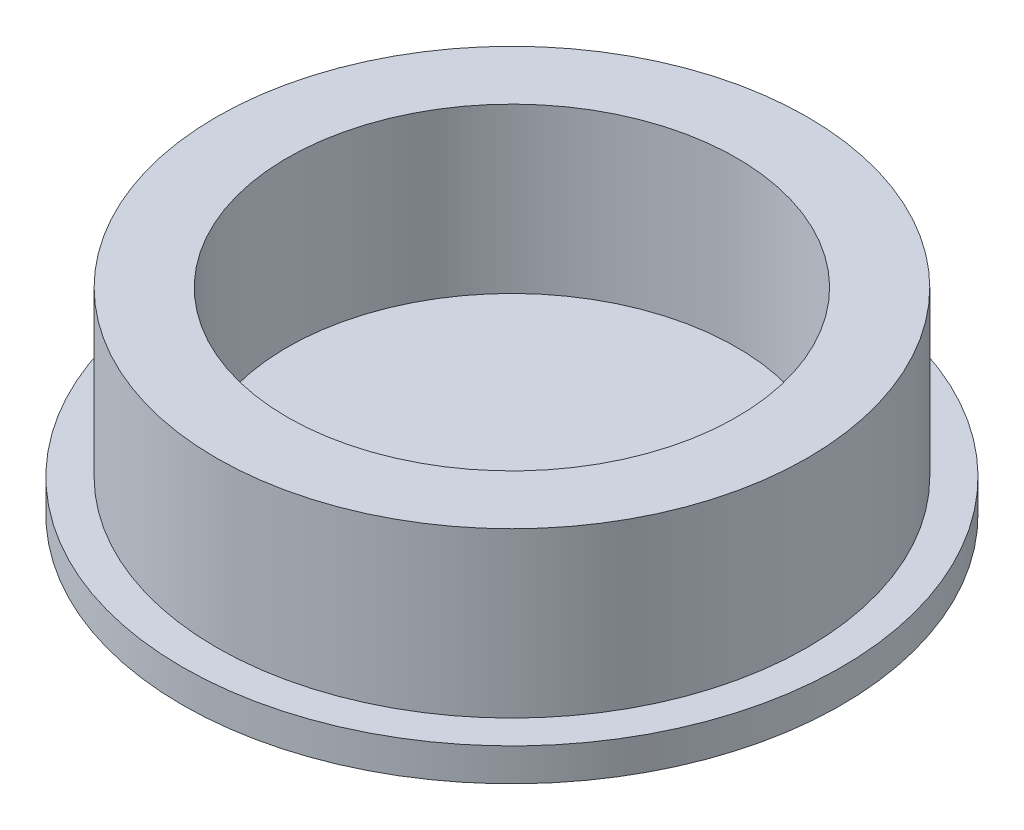
ISO-10303-21;
HEADER;
FILE_DESCRIPTION(('STEP AP214'),'2;1');
FILE_NAME('part.step','',(''),(''),'','','');
FILE_SCHEMA(('AUTOMOTIVE_DESIGN { 1 0 10303 214 1 1 1 1 }'));
ENDSEC;
DATA;
#1=APPLICATION_CONTEXT('core data for automotive mechanical design processes');
#2=APPLICATION_PROTOCOL_DEFINITION('international standard','automotive_design',2000,#1);
#3=PRODUCT_CONTEXT('',#1,'mechanical');
#4=PRODUCT('Part','Part','',(#3));
#5=PRODUCT_RELATED_PRODUCT_CATEGORY('part','',(#4));
#6=PRODUCT_DEFINITION_FORMATION('','',#4);
#7=PRODUCT_DEFINITION_CONTEXT('part definition',#1,'design');
#8=PRODUCT_DEFINITION('design','',#6,#7);
#9=PRODUCT_DEFINITION_SHAPE('','',#8);
#10=(LENGTH_UNIT() NAMED_UNIT(*) SI_UNIT(.MILLI.,.METRE.));
#11=(NAMED_UNIT(*) PLANE_ANGLE_UNIT() SI_UNIT($,.RADIAN.));
#12=(NAMED_UNIT(*) SI_UNIT($,.STERADIAN.) SOLID_ANGLE_UNIT());
#13=UNCERTAINTY_MEASURE_WITH_UNIT(LENGTH_MEASURE(1.E-05),#10,'distance_accuracy_value','');
#14=(GEOMETRIC_REPRESENTATION_CONTEXT(3) GLOBAL_UNCERTAINTY_ASSIGNED_CONTEXT((#13)) GLOBAL_UNIT_ASSIGNED_CONTEXT((#10,
#11,#12)) REPRESENTATION_CONTEXT('',''));
#15=CARTESIAN_POINT('',(0.,0.,0.));
#16=DIRECTION('',(0.,0.,1.));
#17=DIRECTION('',(1.,0.,0.));
#18=AXIS2_PLACEMENT_3D('',#15,#16,#17);
#19=CARTESIAN_POINT('',(0.,1.,0.));
#20=DIRECTION('',(0.,-1.,0.));
#21=DIRECTION('',(0.,0.,-1.));
#22=AXIS2_PLACEMENT_3D('',#19,#20,#21);
#23=CYLINDRICAL_SURFACE('',#22,10.05);
#24=CARTESIAN_POINT('',(0.,1.,0.));
#25=DIRECTION('',(0.,1.,0.));
#26=DIRECTION('',(0.,0.,1.));
#27=AXIS2_PLACEMENT_3D('',#24,#25,#26);
#28=CIRCLE('',#27,10.05);
#29=CARTESIAN_POINT('',(0.,1.,10.05));
#30=VERTEX_POINT('',#29);
#31=EDGE_CURVE('E49',#30,#30,#28,.T.);
#32=ORIENTED_EDGE('',*,*,#31,.F.);
#33=EDGE_LOOP('',(#32));
#34=FACE_BOUND('',#33,.T.);
#35=CARTESIAN_POINT('',(0.,0.,0.));
#36=DIRECTION('',(0.,1.,0.));
#37=DIRECTION('',(0.,0.,1.));
#38=AXIS2_PLACEMENT_3D('',#35,#36,#37);
#39=CIRCLE('',#38,10.05);
#40=CARTESIAN_POINT('',(0.,0.,10.05));
#41=VERTEX_POINT('',#40);
#42=EDGE_CURVE('E53',#41,#41,#39,.T.);
#43=ORIENTED_EDGE('',*,*,#42,.T.);
#44=EDGE_LOOP('',(#43));
#45=FACE_BOUND('',#44,.T.);
#46=ADVANCED_FACE('F39',(#34,#45),#23,.T.);
#47=CARTESIAN_POINT('',(0.,1.,0.));
#48=DIRECTION('',(0.,1.,0.));
#49=DIRECTION('',(0.,0.,1.));
#50=AXIS2_PLACEMENT_3D('',#47,#48,#49);
#51=PLANE('',#50);
#52=CARTESIAN_POINT('',(0.,1.,0.));
#53=DIRECTION('',(0.,1.,0.));
#54=DIRECTION('',(0.,0.,1.));
#55=AXIS2_PLACEMENT_3D('',#52,#53,#54);
#56=CIRCLE('',#55,9.01);
#57=CARTESIAN_POINT('',(0.,1.,9.01));
#58=VERTEX_POINT('',#57);
#59=EDGE_CURVE('E10',#58,#58,#56,.T.);
#60=ORIENTED_EDGE('',*,*,#59,.F.);
#61=EDGE_LOOP('',(#60));
#62=FACE_BOUND('',#61,.T.);
#63=ORIENTED_EDGE('',*,*,#31,.T.);
#64=EDGE_LOOP('',(#63));
#65=FACE_BOUND('',#64,.T.);
#66=ADVANCED_FACE('F79',(#62,#65),#51,.T.);
#67=CARTESIAN_POINT('',(0.,0.,0.));
#68=DIRECTION('',(0.,1.,0.));
#69=DIRECTION('',(0.,0.,1.));
#70=AXIS2_PLACEMENT_3D('',#67,#68,#69);
#71=PLANE('',#70);
#72=ORIENTED_EDGE('',*,*,#42,.F.);
#73=EDGE_LOOP('',(#72));
#74=FACE_BOUND('',#73,.T.);
#75=ADVANCED_FACE('F70',(#74),#71,.F.);
#76=CARTESIAN_POINT('',(0.,-24.4841283939632,0.));
#77=DIRECTION('',(0.,1.,0.));
#78=DIRECTION('',(0.,0.,1.));
#79=AXIS2_PLACEMENT_3D('',#76,#77,#78);
#80=CYLINDRICAL_SURFACE('',#79,9.01);
#81=ORIENTED_EDGE('',*,*,#59,.T.);
#82=EDGE_LOOP('',(#81));
#83=FACE_BOUND('',#82,.T.);
#84=CARTESIAN_POINT('',(0.,6.,0.));
#85=DIRECTION('',(0.,1.,0.));
#86=DIRECTION('',(0.,0.,1.));
#87=AXIS2_PLACEMENT_3D('',#84,#85,#86);
#88=CIRCLE('',#87,9.01);
#89=CARTESIAN_POINT('',(0.,6.,9.01));
#90=VERTEX_POINT('',#89);
#91=EDGE_CURVE('E61',#90,#90,#88,.T.);
#92=ORIENTED_EDGE('',*,*,#91,.F.);
#93=EDGE_LOOP('',(#92));
#94=FACE_BOUND('',#93,.T.);
#95=ADVANCED_FACE('F67',(#83,#94),#80,.T.);
#96=CARTESIAN_POINT('',(0.,1.,0.));
#97=DIRECTION('',(0.,1.,0.));
#98=DIRECTION('',(0.,0.,1.));
#99=AXIS2_PLACEMENT_3D('',#96,#97,#98);
#100=CIRCLE('',#99,6.85);
#101=CARTESIAN_POINT('',(0.,1.,6.85));
#102=VERTEX_POINT('',#101);
#103=EDGE_CURVE('E45',#102,#102,#100,.F.);
#104=ORIENTED_EDGE('',*,*,#103,.F.);
#105=EDGE_LOOP('',(#104));
#106=FACE_BOUND('',#105,.T.);
#107=ADVANCED_FACE('F69',(#106),#51,.T.);
#108=CARTESIAN_POINT('',(0.,6.,0.));
#109=DIRECTION('',(0.,-1.,0.));
#110=DIRECTION('',(0.,0.,-1.));
#111=AXIS2_PLACEMENT_3D('',#108,#109,#110);
#112=CYLINDRICAL_SURFACE('',#111,6.85);
#113=CARTESIAN_POINT('',(0.,6.,0.));
#114=DIRECTION('',(0.,1.,0.));
#115=DIRECTION('',(0.,0.,1.));
#116=AXIS2_PLACEMENT_3D('',#113,#114,#115);
#117=CIRCLE('',#116,6.85);
#118=CARTESIAN_POINT('',(0.,6.,6.85));
#119=VERTEX_POINT('',#118);
#120=EDGE_CURVE('E57',#119,#119,#117,.T.);
#121=ORIENTED_EDGE('',*,*,#120,.T.);
#122=EDGE_LOOP('',(#121));
#123=FACE_BOUND('',#122,.T.);
#124=ORIENTED_EDGE('',*,*,#103,.T.);
#125=EDGE_LOOP('',(#124));
#126=FACE_BOUND('',#125,.T.);
#127=ADVANCED_FACE('F76',(#123,#126),#112,.F.);
#128=CARTESIAN_POINT('',(0.,6.,0.));
#129=DIRECTION('',(0.,1.,0.));
#130=DIRECTION('',(0.,0.,1.));
#131=AXIS2_PLACEMENT_3D('',#128,#129,#130);
#132=PLANE('',#131);
#133=ORIENTED_EDGE('',*,*,#120,.F.);
#134=EDGE_LOOP('',(#133));
#135=FACE_BOUND('',#134,.T.);
#136=ORIENTED_EDGE('',*,*,#91,.T.);
#137=EDGE_LOOP('',(#136));
#138=FACE_BOUND('',#137,.T.);
#139=ADVANCED_FACE('F65',(#135,#138),#132,.T.);
#140=CLOSED_SHELL('',(#46,#66,#75,#95,#107,#127,#139));
#141=MANIFOLD_SOLID_BREP('B2',#140);
#142=ADVANCED_BREP_SHAPE_REPRESENTATION('',(#18,#141),#14);
#143=SHAPE_DEFINITION_REPRESENTATION(#9,#142);
ENDSEC;
END-ISO-10303-21;
